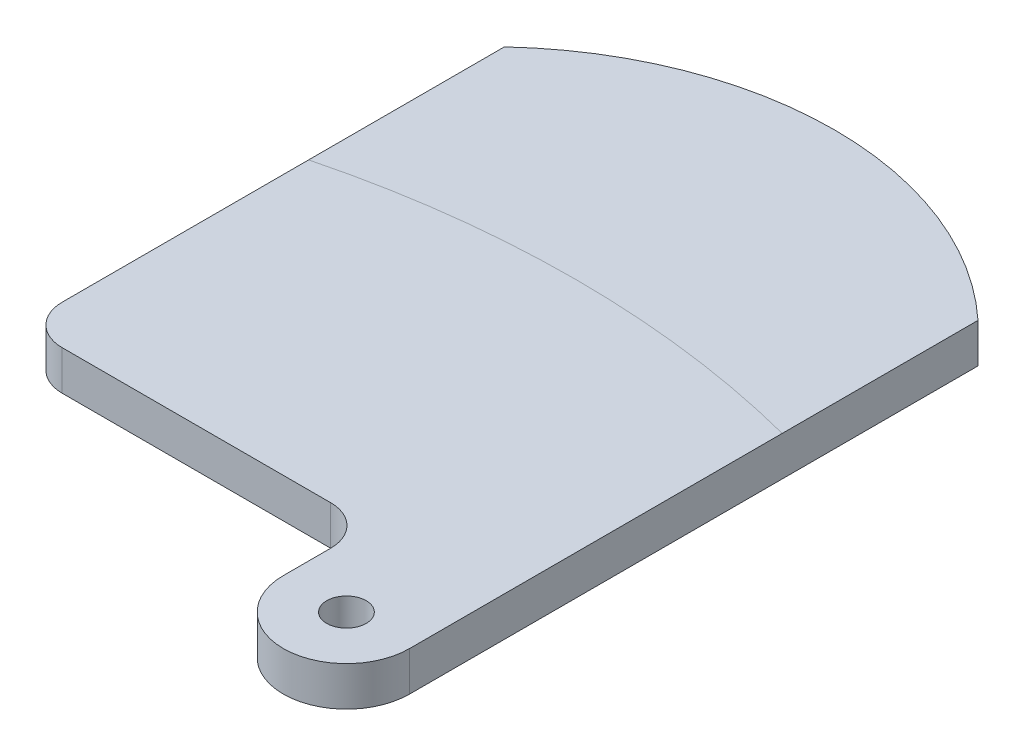
ISO-10303-21;
HEADER;
FILE_DESCRIPTION(('STEP AP214'),'2;1');
FILE_NAME('part.step','',(''),(''),'','','');
FILE_SCHEMA(('AUTOMOTIVE_DESIGN { 1 0 10303 214 1 1 1 1 }'));
ENDSEC;
DATA;
#1=APPLICATION_CONTEXT('core data for automotive mechanical design processes');
#2=APPLICATION_PROTOCOL_DEFINITION('international standard','automotive_design',2000,#1);
#3=PRODUCT_CONTEXT('',#1,'mechanical');
#4=PRODUCT('Part','Part','',(#3));
#5=PRODUCT_RELATED_PRODUCT_CATEGORY('part','',(#4));
#6=PRODUCT_DEFINITION_FORMATION('','',#4);
#7=PRODUCT_DEFINITION_CONTEXT('part definition',#1,'design');
#8=PRODUCT_DEFINITION('design','',#6,#7);
#9=PRODUCT_DEFINITION_SHAPE('','',#8);
#10=(LENGTH_UNIT() NAMED_UNIT(*) SI_UNIT(.MILLI.,.METRE.));
#11=(NAMED_UNIT(*) PLANE_ANGLE_UNIT() SI_UNIT($,.RADIAN.));
#12=(NAMED_UNIT(*) SI_UNIT($,.STERADIAN.) SOLID_ANGLE_UNIT());
#13=UNCERTAINTY_MEASURE_WITH_UNIT(LENGTH_MEASURE(1.E-05),#10,'distance_accuracy_value','');
#14=(GEOMETRIC_REPRESENTATION_CONTEXT(3) GLOBAL_UNCERTAINTY_ASSIGNED_CONTEXT((#13)) GLOBAL_UNIT_ASSIGNED_CONTEXT((#10,
#11,#12)) REPRESENTATION_CONTEXT('',''));
#15=CARTESIAN_POINT('',(0.,0.,0.));
#16=DIRECTION('',(0.,0.,1.));
#17=DIRECTION('',(1.,0.,0.));
#18=AXIS2_PLACEMENT_3D('',#15,#16,#17);
#19=CARTESIAN_POINT('',(13.97,0.,0.));
#20=DIRECTION('',(0.,-1.,0.));
#21=DIRECTION('',(0.,0.,-1.));
#22=AXIS2_PLACEMENT_3D('',#19,#20,#21);
#23=PLANE('',#22);
#24=CARTESIAN_POINT('',(13.97,0.,0.));
#25=DIRECTION('',(0.,1.,0.));
#26=DIRECTION('',(0.,0.,1.));
#27=AXIS2_PLACEMENT_3D('',#24,#25,#26);
#28=CIRCLE('',#27,1.5875);
#29=CARTESIAN_POINT('',(13.97,0.,1.5875));
#30=VERTEX_POINT('',#29);
#31=EDGE_CURVE('E176',#30,#30,#28,.T.);
#32=ORIENTED_EDGE('',*,*,#31,.T.);
#33=EDGE_LOOP('',(#32));
#34=FACE_BOUND('',#33,.T.);
#35=DIRECTION('',(0.,0.,1.));
#36=VECTOR('',#35,1.);
#37=CARTESIAN_POINT('',(-19.05,0.,-10.16));
#38=LINE('',#37,#36);
#39=CARTESIAN_POINT('',(-19.05,0.,-29.9736170321738));
#40=VERTEX_POINT('',#39);
#41=CARTESIAN_POINT('',(-19.05,0.,-10.16));
#42=VERTEX_POINT('',#41);
#43=EDGE_CURVE('E169',#40,#42,#38,.T.);
#44=ORIENTED_EDGE('',*,*,#43,.F.);
#45=CARTESIAN_POINT('',(0.,0.,43.8067157130775));
#46=DIRECTION('',(0.,-1.,0.));
#47=DIRECTION('',(0.,0.,-1.));
#48=AXIS2_PLACEMENT_3D('',#45,#46,#47);
#49=CIRCLE('',#48,76.2);
#50=CARTESIAN_POINT('',(19.05,0.,-29.9736170321738));
#51=VERTEX_POINT('',#50);
#52=EDGE_CURVE('E11',#40,#51,#49,.T.);
#53=ORIENTED_EDGE('',*,*,#52,.T.);
#54=DIRECTION('',(0.,0.,-1.));
#55=VECTOR('',#54,1.);
#56=CARTESIAN_POINT('',(19.05,0.,-10.16));
#57=LINE('',#56,#55);
#58=CARTESIAN_POINT('',(19.05,0.,0.));
#59=VERTEX_POINT('',#58);
#60=EDGE_CURVE('E172',#59,#51,#57,.T.);
#61=ORIENTED_EDGE('',*,*,#60,.F.);
#62=CARTESIAN_POINT('',(13.97,0.,0.));
#63=DIRECTION('',(0.,1.,0.));
#64=DIRECTION('',(0.,0.,-1.));
#65=AXIS2_PLACEMENT_3D('',#62,#63,#64);
#66=CIRCLE('',#65,5.08);
#67=CARTESIAN_POINT('',(8.89,0.,0.));
#68=VERTEX_POINT('',#67);
#69=EDGE_CURVE('E135',#68,#59,#66,.T.);
#70=ORIENTED_EDGE('',*,*,#69,.F.);
#71=DIRECTION('',(0.,0.,1.));
#72=VECTOR('',#71,1.);
#73=CARTESIAN_POINT('',(8.89,0.,0.));
#74=LINE('',#73,#72);
#75=CARTESIAN_POINT('',(8.89,0.,-3.81));
#76=VERTEX_POINT('',#75);
#77=EDGE_CURVE('E132',#76,#68,#74,.T.);
#78=ORIENTED_EDGE('',*,*,#77,.F.);
#79=CARTESIAN_POINT('',(5.715,0.,-3.81));
#80=DIRECTION('',(0.,-1.,0.));
#81=DIRECTION('',(0.,0.,1.));
#82=AXIS2_PLACEMENT_3D('',#79,#80,#81);
#83=CIRCLE('',#82,3.175);
#84=CARTESIAN_POINT('',(5.715,0.,-6.985));
#85=VERTEX_POINT('',#84);
#86=EDGE_CURVE('E160',#85,#76,#83,.T.);
#87=ORIENTED_EDGE('',*,*,#86,.F.);
#88=DIRECTION('',(1.,0.,0.));
#89=VECTOR('',#88,1.);
#90=CARTESIAN_POINT('',(5.715,0.,-6.985));
#91=LINE('',#90,#89);
#92=CARTESIAN_POINT('',(-15.875,0.,-6.985));
#93=VERTEX_POINT('',#92);
#94=EDGE_CURVE('E162',#93,#85,#91,.T.);
#95=ORIENTED_EDGE('',*,*,#94,.F.);
#96=CARTESIAN_POINT('',(-15.875,0.,-10.16));
#97=DIRECTION('',(0.,1.,0.));
#98=DIRECTION('',(0.,0.,-1.));
#99=AXIS2_PLACEMENT_3D('',#96,#97,#98);
#100=CIRCLE('',#99,3.175);
#101=EDGE_CURVE('E164',#42,#93,#100,.T.);
#102=ORIENTED_EDGE('',*,*,#101,.F.);
#103=EDGE_LOOP('',(#44,#53,#61,#70,#78,#87,#95,#102));
#104=FACE_BOUND('',#103,.T.);
#105=ADVANCED_FACE('F37',(#34,#104),#23,.T.);
#106=CARTESIAN_POINT('',(13.97,3.175,0.));
#107=DIRECTION('',(0.,-1.,0.));
#108=DIRECTION('',(0.,0.,-1.));
#109=AXIS2_PLACEMENT_3D('',#106,#107,#108);
#110=PLANE('',#109);
#111=CARTESIAN_POINT('',(13.97,3.175,0.));
#112=DIRECTION('',(0.,1.,0.));
#113=DIRECTION('',(0.,0.,1.));
#114=AXIS2_PLACEMENT_3D('',#111,#112,#113);
#115=CIRCLE('',#114,1.5875);
#116=CARTESIAN_POINT('',(13.97,3.175,1.5875));
#117=VERTEX_POINT('',#116);
#118=EDGE_CURVE('E191',#117,#117,#115,.T.);
#119=ORIENTED_EDGE('',*,*,#118,.F.);
#120=EDGE_LOOP('',(#119));
#121=FACE_BOUND('',#120,.T.);
#122=CARTESIAN_POINT('',(0.,3.175,43.8067157130775));
#123=DIRECTION('',(0.,-1.,0.));
#124=DIRECTION('',(0.,0.,-1.));
#125=AXIS2_PLACEMENT_3D('',#122,#123,#124);
#126=CIRCLE('',#125,76.2);
#127=CARTESIAN_POINT('',(-19.05,3.175,-29.9736170321738));
#128=VERTEX_POINT('',#127);
#129=CARTESIAN_POINT('',(19.05,3.175,-29.9736170321738));
#130=VERTEX_POINT('',#129);
#131=EDGE_CURVE('E41',#128,#130,#126,.T.);
#132=ORIENTED_EDGE('',*,*,#131,.F.);
#133=DIRECTION('',(0.,0.,1.));
#134=VECTOR('',#133,1.);
#135=CARTESIAN_POINT('',(-19.05,3.175,-10.16));
#136=LINE('',#135,#134);
#137=CARTESIAN_POINT('',(-19.05,3.175,-10.16));
#138=VERTEX_POINT('',#137);
#139=EDGE_CURVE('E187',#128,#138,#136,.T.);
#140=ORIENTED_EDGE('',*,*,#139,.T.);
#141=CARTESIAN_POINT('',(-15.875,3.175,-10.16));
#142=DIRECTION('',(0.,1.,0.));
#143=DIRECTION('',(0.,0.,-1.));
#144=AXIS2_PLACEMENT_3D('',#141,#142,#143);
#145=CIRCLE('',#144,3.175);
#146=CARTESIAN_POINT('',(-15.875,3.175,-6.985));
#147=VERTEX_POINT('',#146);
#148=EDGE_CURVE('E182',#138,#147,#145,.T.);
#149=ORIENTED_EDGE('',*,*,#148,.T.);
#150=DIRECTION('',(1.,0.,0.));
#151=VECTOR('',#150,1.);
#152=CARTESIAN_POINT('',(5.715,3.175,-6.985));
#153=LINE('',#152,#151);
#154=CARTESIAN_POINT('',(5.715,3.175,-6.985));
#155=VERTEX_POINT('',#154);
#156=EDGE_CURVE('E180',#147,#155,#153,.T.);
#157=ORIENTED_EDGE('',*,*,#156,.T.);
#158=CARTESIAN_POINT('',(5.715,3.175,-3.81));
#159=DIRECTION('',(0.,-1.,0.));
#160=DIRECTION('',(0.,0.,1.));
#161=AXIS2_PLACEMENT_3D('',#158,#159,#160);
#162=CIRCLE('',#161,3.175);
#163=CARTESIAN_POINT('',(8.89,3.175,-3.81));
#164=VERTEX_POINT('',#163);
#165=EDGE_CURVE('E178',#155,#164,#162,.T.);
#166=ORIENTED_EDGE('',*,*,#165,.T.);
#167=DIRECTION('',(0.,0.,1.));
#168=VECTOR('',#167,1.);
#169=CARTESIAN_POINT('',(8.89,3.175,0.));
#170=LINE('',#169,#168);
#171=CARTESIAN_POINT('',(8.89,3.175,0.));
#172=VERTEX_POINT('',#171);
#173=EDGE_CURVE('E128',#164,#172,#170,.T.);
#174=ORIENTED_EDGE('',*,*,#173,.T.);
#175=CARTESIAN_POINT('',(13.97,3.175,0.));
#176=DIRECTION('',(0.,1.,0.));
#177=DIRECTION('',(0.,0.,-1.));
#178=AXIS2_PLACEMENT_3D('',#175,#176,#177);
#179=CIRCLE('',#178,5.08);
#180=CARTESIAN_POINT('',(19.05,3.175,0.));
#181=VERTEX_POINT('',#180);
#182=EDGE_CURVE('E125',#172,#181,#179,.T.);
#183=ORIENTED_EDGE('',*,*,#182,.T.);
#184=DIRECTION('',(0.,0.,-1.));
#185=VECTOR('',#184,1.);
#186=CARTESIAN_POINT('',(19.05,3.175,-10.16));
#187=LINE('',#186,#185);
#188=EDGE_CURVE('E112',#181,#130,#187,.T.);
#189=ORIENTED_EDGE('',*,*,#188,.T.);
#190=EDGE_LOOP('',(#132,#140,#149,#157,#166,#174,#183,#189));
#191=FACE_BOUND('',#190,.T.);
#192=ADVANCED_FACE('F126',(#121,#191),#110,.F.);
#193=CARTESIAN_POINT('',(13.97,3.175,0.));
#194=DIRECTION('',(0.,-1.,0.));
#195=DIRECTION('',(0.,0.,-1.));
#196=AXIS2_PLACEMENT_3D('',#193,#194,#195);
#197=CYLINDRICAL_SURFACE('',#196,5.08);
#198=ORIENTED_EDGE('',*,*,#69,.T.);
#199=DIRECTION('',(0.,-1.,0.));
#200=VECTOR('',#199,1.);
#201=CARTESIAN_POINT('',(19.05,3.175,0.));
#202=LINE('',#201,#200);
#203=EDGE_CURVE('E117',#181,#59,#202,.T.);
#204=ORIENTED_EDGE('',*,*,#203,.F.);
#205=ORIENTED_EDGE('',*,*,#182,.F.);
#206=DIRECTION('',(0.,-1.,0.));
#207=VECTOR('',#206,1.);
#208=CARTESIAN_POINT('',(8.89,3.175,0.));
#209=LINE('',#208,#207);
#210=EDGE_CURVE('E157',#172,#68,#209,.T.);
#211=ORIENTED_EDGE('',*,*,#210,.T.);
#212=EDGE_LOOP('',(#198,#204,#205,#211));
#213=FACE_BOUND('',#212,.T.);
#214=ADVANCED_FACE('F39',(#213),#197,.T.);
#215=CARTESIAN_POINT('',(19.05,3.175,-10.16));
#216=DIRECTION('',(-1.,0.,0.));
#217=DIRECTION('',(0.,0.,1.));
#218=AXIS2_PLACEMENT_3D('',#215,#216,#217);
#219=PLANE('',#218);
#220=ORIENTED_EDGE('',*,*,#60,.T.);
#221=CARTESIAN_POINT('',(19.05,0.,-45.72));
#222=VERTEX_POINT('',#221);
#223=EDGE_CURVE('E174',#51,#222,#57,.T.);
#224=ORIENTED_EDGE('',*,*,#223,.T.);
#225=DIRECTION('',(0.,-1.,0.));
#226=VECTOR('',#225,1.);
#227=CARTESIAN_POINT('',(19.05,3.175,-45.72));
#228=LINE('',#227,#226);
#229=CARTESIAN_POINT('',(19.05,3.175,-45.72));
#230=VERTEX_POINT('',#229);
#231=EDGE_CURVE('E136',#230,#222,#228,.T.);
#232=ORIENTED_EDGE('',*,*,#231,.F.);
#233=EDGE_CURVE('E120',#130,#230,#187,.T.);
#234=ORIENTED_EDGE('',*,*,#233,.F.);
#235=ORIENTED_EDGE('',*,*,#188,.F.);
#236=ORIENTED_EDGE('',*,*,#203,.T.);
#237=EDGE_LOOP('',(#220,#224,#232,#234,#235,#236));
#238=FACE_BOUND('',#237,.T.);
#239=ADVANCED_FACE('F115',(#238),#219,.F.);
#240=CARTESIAN_POINT('',(0.,3.175,-25.2812842869225));
#241=DIRECTION('',(0.,-1.,0.));
#242=DIRECTION('',(0.,0.,-1.));
#243=AXIS2_PLACEMENT_3D('',#240,#241,#242);
#244=CYLINDRICAL_SURFACE('',#243,27.94);
#245=CARTESIAN_POINT('',(0.,0.,-25.2812842869225));
#246=DIRECTION('',(0.,1.,0.));
#247=DIRECTION('',(0.,0.,-1.));
#248=AXIS2_PLACEMENT_3D('',#245,#246,#247);
#249=CIRCLE('',#248,27.94);
#250=CARTESIAN_POINT('',(-19.05,0.,-45.72));
#251=VERTEX_POINT('',#250);
#252=EDGE_CURVE('E170',#222,#251,#249,.T.);
#253=ORIENTED_EDGE('',*,*,#252,.T.);
#254=DIRECTION('',(0.,-1.,0.));
#255=VECTOR('',#254,1.);
#256=CARTESIAN_POINT('',(-19.05,3.175,-45.72));
#257=LINE('',#256,#255);
#258=CARTESIAN_POINT('',(-19.05,3.175,-45.72));
#259=VERTEX_POINT('',#258);
#260=EDGE_CURVE('E140',#259,#251,#257,.T.);
#261=ORIENTED_EDGE('',*,*,#260,.F.);
#262=CARTESIAN_POINT('',(0.,3.175,-25.2812842869225));
#263=DIRECTION('',(0.,1.,0.));
#264=DIRECTION('',(0.,0.,-1.));
#265=AXIS2_PLACEMENT_3D('',#262,#263,#264);
#266=CIRCLE('',#265,27.94);
#267=EDGE_CURVE('E122',#230,#259,#266,.T.);
#268=ORIENTED_EDGE('',*,*,#267,.F.);
#269=ORIENTED_EDGE('',*,*,#231,.T.);
#270=EDGE_LOOP('',(#253,#261,#268,#269));
#271=FACE_BOUND('',#270,.T.);
#272=ADVANCED_FACE('F242',(#271),#244,.T.);
#273=CARTESIAN_POINT('',(-19.05,3.175,-10.16));
#274=DIRECTION('',(1.,0.,0.));
#275=DIRECTION('',(0.,0.,-1.));
#276=AXIS2_PLACEMENT_3D('',#273,#274,#275);
#277=PLANE('',#276);
#278=EDGE_CURVE('E166',#251,#40,#38,.T.);
#279=ORIENTED_EDGE('',*,*,#278,.T.);
#280=ORIENTED_EDGE('',*,*,#43,.T.);
#281=DIRECTION('',(0.,-1.,0.));
#282=VECTOR('',#281,1.);
#283=CARTESIAN_POINT('',(-19.05,3.175,-10.16));
#284=LINE('',#283,#282);
#285=EDGE_CURVE('E145',#138,#42,#284,.T.);
#286=ORIENTED_EDGE('',*,*,#285,.F.);
#287=ORIENTED_EDGE('',*,*,#139,.F.);
#288=EDGE_CURVE('E184',#259,#128,#136,.T.);
#289=ORIENTED_EDGE('',*,*,#288,.F.);
#290=ORIENTED_EDGE('',*,*,#260,.T.);
#291=EDGE_LOOP('',(#279,#280,#286,#287,#289,#290));
#292=FACE_BOUND('',#291,.T.);
#293=ADVANCED_FACE('F223',(#292),#277,.F.);
#294=CARTESIAN_POINT('',(-15.875,3.175,-10.16));
#295=DIRECTION('',(0.,-1.,0.));
#296=DIRECTION('',(0.,0.,-1.));
#297=AXIS2_PLACEMENT_3D('',#294,#295,#296);
#298=CYLINDRICAL_SURFACE('',#297,3.175);
#299=ORIENTED_EDGE('',*,*,#101,.T.);
#300=DIRECTION('',(0.,-1.,0.));
#301=VECTOR('',#300,1.);
#302=CARTESIAN_POINT('',(-15.875,3.175,-6.985));
#303=LINE('',#302,#301);
#304=EDGE_CURVE('E148',#147,#93,#303,.T.);
#305=ORIENTED_EDGE('',*,*,#304,.F.);
#306=ORIENTED_EDGE('',*,*,#148,.F.);
#307=ORIENTED_EDGE('',*,*,#285,.T.);
#308=EDGE_LOOP('',(#299,#305,#306,#307));
#309=FACE_BOUND('',#308,.T.);
#310=ADVANCED_FACE('F230',(#309),#298,.T.);
#311=CARTESIAN_POINT('',(5.715,3.175,-6.985));
#312=DIRECTION('',(0.,0.,-1.));
#313=DIRECTION('',(-1.,0.,0.));
#314=AXIS2_PLACEMENT_3D('',#311,#312,#313);
#315=PLANE('',#314);
#316=ORIENTED_EDGE('',*,*,#94,.T.);
#317=DIRECTION('',(0.,-1.,0.));
#318=VECTOR('',#317,1.);
#319=CARTESIAN_POINT('',(5.715,3.175,-6.985));
#320=LINE('',#319,#318);
#321=EDGE_CURVE('E151',#155,#85,#320,.T.);
#322=ORIENTED_EDGE('',*,*,#321,.F.);
#323=ORIENTED_EDGE('',*,*,#156,.F.);
#324=ORIENTED_EDGE('',*,*,#304,.T.);
#325=EDGE_LOOP('',(#316,#322,#323,#324));
#326=FACE_BOUND('',#325,.T.);
#327=ADVANCED_FACE('F234',(#326),#315,.F.);
#328=CARTESIAN_POINT('',(5.715,3.175,-3.81));
#329=DIRECTION('',(0.,-1.,0.));
#330=DIRECTION('',(0.,0.,-1.));
#331=AXIS2_PLACEMENT_3D('',#328,#329,#330);
#332=CYLINDRICAL_SURFACE('',#331,3.175);
#333=ORIENTED_EDGE('',*,*,#86,.T.);
#334=DIRECTION('',(0.,-1.,0.));
#335=VECTOR('',#334,1.);
#336=CARTESIAN_POINT('',(8.89,3.175,-3.81));
#337=LINE('',#336,#335);
#338=EDGE_CURVE('E154',#164,#76,#337,.T.);
#339=ORIENTED_EDGE('',*,*,#338,.F.);
#340=ORIENTED_EDGE('',*,*,#165,.F.);
#341=ORIENTED_EDGE('',*,*,#321,.T.);
#342=EDGE_LOOP('',(#333,#339,#340,#341));
#343=FACE_BOUND('',#342,.T.);
#344=ADVANCED_FACE('F215',(#343),#332,.F.);
#345=CARTESIAN_POINT('',(8.89,3.175,0.));
#346=DIRECTION('',(1.,0.,0.));
#347=DIRECTION('',(0.,0.,-1.));
#348=AXIS2_PLACEMENT_3D('',#345,#346,#347);
#349=PLANE('',#348);
#350=ORIENTED_EDGE('',*,*,#77,.T.);
#351=ORIENTED_EDGE('',*,*,#210,.F.);
#352=ORIENTED_EDGE('',*,*,#173,.F.);
#353=ORIENTED_EDGE('',*,*,#338,.T.);
#354=EDGE_LOOP('',(#350,#351,#352,#353));
#355=FACE_BOUND('',#354,.T.);
#356=ADVANCED_FACE('F209',(#355),#349,.F.);
#357=ORIENTED_EDGE('',*,*,#288,.T.);
#358=ORIENTED_EDGE('',*,*,#131,.T.);
#359=ORIENTED_EDGE('',*,*,#233,.T.);
#360=ORIENTED_EDGE('',*,*,#267,.T.);
#361=EDGE_LOOP('',(#357,#358,#359,#360));
#362=FACE_BOUND('',#361,.T.);
#363=ADVANCED_FACE('F199',(#362),#110,.F.);
#364=ORIENTED_EDGE('',*,*,#52,.F.);
#365=ORIENTED_EDGE('',*,*,#278,.F.);
#366=ORIENTED_EDGE('',*,*,#252,.F.);
#367=ORIENTED_EDGE('',*,*,#223,.F.);
#368=EDGE_LOOP('',(#364,#365,#366,#367));
#369=FACE_BOUND('',#368,.T.);
#370=ADVANCED_FACE('F206',(#369),#23,.T.);
#371=CARTESIAN_POINT('',(13.97,3.175,0.));
#372=DIRECTION('',(0.,1.,0.));
#373=DIRECTION('',(0.,0.,1.));
#374=AXIS2_PLACEMENT_3D('',#371,#372,#373);
#375=CYLINDRICAL_SURFACE('',#374,1.5875);
#376=ORIENTED_EDGE('',*,*,#31,.F.);
#377=EDGE_LOOP('',(#376));
#378=FACE_BOUND('',#377,.T.);
#379=ORIENTED_EDGE('',*,*,#118,.T.);
#380=EDGE_LOOP('',(#379));
#381=FACE_BOUND('',#380,.T.);
#382=ADVANCED_FACE('F195',(#378,#381),#375,.F.);
#383=CLOSED_SHELL('',(#105,#192,#214,#239,#272,#293,#310,#327,#344,#356,#363,#370,#382));
#384=MANIFOLD_SOLID_BREP('B2',#383);
#385=ADVANCED_BREP_SHAPE_REPRESENTATION('',(#18,#384),#14);
#386=SHAPE_DEFINITION_REPRESENTATION(#9,#385);
ENDSEC;
END-ISO-10303-21;
